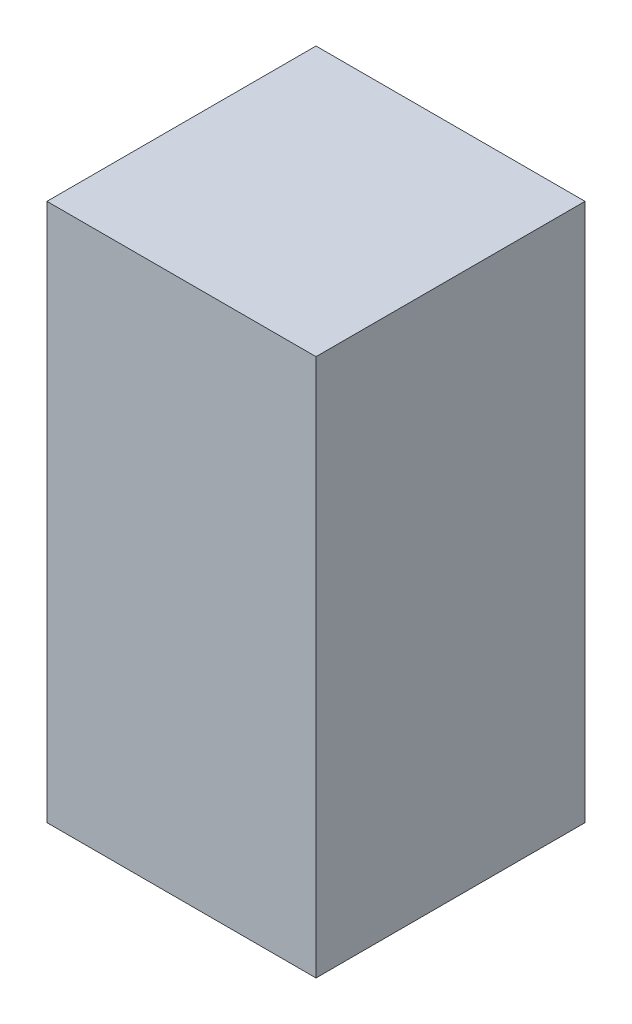
ISO-10303-21;
HEADER;
FILE_DESCRIPTION(('STEP AP214'),'2;1');
FILE_NAME('part.step','',(''),(''),'','','');
FILE_SCHEMA(('AUTOMOTIVE_DESIGN { 1 0 10303 214 1 1 1 1 }'));
ENDSEC;
DATA;
#1=APPLICATION_CONTEXT('core data for automotive mechanical design processes');
#2=APPLICATION_PROTOCOL_DEFINITION('international standard','automotive_design',2000,#1);
#3=PRODUCT_CONTEXT('',#1,'mechanical');
#4=PRODUCT('Part','Part','',(#3));
#5=PRODUCT_RELATED_PRODUCT_CATEGORY('part','',(#4));
#6=PRODUCT_DEFINITION_FORMATION('','',#4);
#7=PRODUCT_DEFINITION_CONTEXT('part definition',#1,'design');
#8=PRODUCT_DEFINITION('design','',#6,#7);
#9=PRODUCT_DEFINITION_SHAPE('','',#8);
#10=(LENGTH_UNIT() NAMED_UNIT(*) SI_UNIT(.MILLI.,.METRE.));
#11=(NAMED_UNIT(*) PLANE_ANGLE_UNIT() SI_UNIT($,.RADIAN.));
#12=(NAMED_UNIT(*) SI_UNIT($,.STERADIAN.) SOLID_ANGLE_UNIT());
#13=UNCERTAINTY_MEASURE_WITH_UNIT(LENGTH_MEASURE(1.E-05),#10,'distance_accuracy_value','');
#14=(GEOMETRIC_REPRESENTATION_CONTEXT(3) GLOBAL_UNCERTAINTY_ASSIGNED_CONTEXT((#13)) GLOBAL_UNIT_ASSIGNED_CONTEXT((#10,
#11,#12)) REPRESENTATION_CONTEXT('',''));
#15=CARTESIAN_POINT('',(0.,0.,0.));
#16=DIRECTION('',(0.,0.,1.));
#17=DIRECTION('',(1.,0.,0.));
#18=AXIS2_PLACEMENT_3D('',#15,#16,#17);
#19=CARTESIAN_POINT('',(-63.5,254.,-63.5));
#20=DIRECTION('',(1.,0.,0.));
#21=DIRECTION('',(0.,0.,-1.));
#22=AXIS2_PLACEMENT_3D('',#19,#20,#21);
#23=PLANE('',#22);
#24=DIRECTION('',(0.,0.,1.));
#25=VECTOR('',#24,1.);
#26=CARTESIAN_POINT('',(-63.5,0.,-63.5));
#27=LINE('',#26,#25);
#28=CARTESIAN_POINT('',(-63.5,0.,-63.5));
#29=VERTEX_POINT('',#28);
#30=CARTESIAN_POINT('',(-63.5,0.,63.5));
#31=VERTEX_POINT('',#30);
#32=EDGE_CURVE('E117',#29,#31,#27,.T.);
#33=ORIENTED_EDGE('',*,*,#32,.T.);
#34=DIRECTION('',(0.,-1.,0.));
#35=VECTOR('',#34,1.);
#36=CARTESIAN_POINT('',(-63.5,254.,63.5));
#37=LINE('',#36,#35);
#38=CARTESIAN_POINT('',(-63.5,254.,63.5));
#39=VERTEX_POINT('',#38);
#40=EDGE_CURVE('E11',#39,#31,#37,.T.);
#41=ORIENTED_EDGE('',*,*,#40,.F.);
#42=DIRECTION('',(0.,0.,1.));
#43=VECTOR('',#42,1.);
#44=CARTESIAN_POINT('',(-63.5,254.,-63.5));
#45=LINE('',#44,#43);
#46=CARTESIAN_POINT('',(-63.5,254.,-63.5));
#47=VERTEX_POINT('',#46);
#48=EDGE_CURVE('E101',#47,#39,#45,.T.);
#49=ORIENTED_EDGE('',*,*,#48,.F.);
#50=DIRECTION('',(0.,-1.,0.));
#51=VECTOR('',#50,1.);
#52=CARTESIAN_POINT('',(-63.5,254.,-63.5));
#53=LINE('',#52,#51);
#54=EDGE_CURVE('E113',#47,#29,#53,.T.);
#55=ORIENTED_EDGE('',*,*,#54,.T.);
#56=EDGE_LOOP('',(#33,#41,#49,#55));
#57=FACE_BOUND('',#56,.T.);
#58=ADVANCED_FACE('F49',(#57),#23,.F.);
#59=CARTESIAN_POINT('',(63.5,254.,63.5));
#60=DIRECTION('',(0.,0.,-1.));
#61=DIRECTION('',(-1.,0.,0.));
#62=AXIS2_PLACEMENT_3D('',#59,#60,#61);
#63=PLANE('',#62);
#64=DIRECTION('',(1.,0.,0.));
#65=VECTOR('',#64,1.);
#66=CARTESIAN_POINT('',(63.5,0.,63.5));
#67=LINE('',#66,#65);
#68=CARTESIAN_POINT('',(63.5,0.,63.5));
#69=VERTEX_POINT('',#68);
#70=EDGE_CURVE('E106',#31,#69,#67,.T.);
#71=ORIENTED_EDGE('',*,*,#70,.T.);
#72=DIRECTION('',(0.,-1.,0.));
#73=VECTOR('',#72,1.);
#74=CARTESIAN_POINT('',(63.5,254.,63.5));
#75=LINE('',#74,#73);
#76=CARTESIAN_POINT('',(63.5,254.,63.5));
#77=VERTEX_POINT('',#76);
#78=EDGE_CURVE('E58',#77,#69,#75,.T.);
#79=ORIENTED_EDGE('',*,*,#78,.F.);
#80=DIRECTION('',(1.,0.,0.));
#81=VECTOR('',#80,1.);
#82=CARTESIAN_POINT('',(63.5,254.,63.5));
#83=LINE('',#82,#81);
#84=EDGE_CURVE('E96',#39,#77,#83,.T.);
#85=ORIENTED_EDGE('',*,*,#84,.F.);
#86=ORIENTED_EDGE('',*,*,#40,.T.);
#87=EDGE_LOOP('',(#71,#79,#85,#86));
#88=FACE_BOUND('',#87,.T.);
#89=ADVANCED_FACE('F105',(#88),#63,.F.);
#90=CARTESIAN_POINT('',(63.5,254.,-63.5));
#91=DIRECTION('',(-1.,0.,0.));
#92=DIRECTION('',(0.,0.,1.));
#93=AXIS2_PLACEMENT_3D('',#90,#91,#92);
#94=PLANE('',#93);
#95=DIRECTION('',(0.,0.,-1.));
#96=VECTOR('',#95,1.);
#97=CARTESIAN_POINT('',(63.5,0.,-63.5));
#98=LINE('',#97,#96);
#99=CARTESIAN_POINT('',(63.5,0.,-63.5));
#100=VERTEX_POINT('',#99);
#101=EDGE_CURVE('E83',#69,#100,#98,.T.);
#102=ORIENTED_EDGE('',*,*,#101,.T.);
#103=DIRECTION('',(0.,-1.,0.));
#104=VECTOR('',#103,1.);
#105=CARTESIAN_POINT('',(63.5,254.,-63.5));
#106=LINE('',#105,#104);
#107=CARTESIAN_POINT('',(63.5,254.,-63.5));
#108=VERTEX_POINT('',#107);
#109=EDGE_CURVE('E108',#108,#100,#106,.T.);
#110=ORIENTED_EDGE('',*,*,#109,.F.);
#111=DIRECTION('',(0.,0.,-1.));
#112=VECTOR('',#111,1.);
#113=CARTESIAN_POINT('',(63.5,254.,-63.5));
#114=LINE('',#113,#112);
#115=EDGE_CURVE('E99',#77,#108,#114,.T.);
#116=ORIENTED_EDGE('',*,*,#115,.F.);
#117=ORIENTED_EDGE('',*,*,#78,.T.);
#118=EDGE_LOOP('',(#102,#110,#116,#117));
#119=FACE_BOUND('',#118,.T.);
#120=ADVANCED_FACE('F109',(#119),#94,.F.);
#121=CARTESIAN_POINT('',(63.5,254.,-63.5));
#122=DIRECTION('',(0.,0.,1.));
#123=DIRECTION('',(1.,0.,0.));
#124=AXIS2_PLACEMENT_3D('',#121,#122,#123);
#125=PLANE('',#124);
#126=DIRECTION('',(-1.,0.,0.));
#127=VECTOR('',#126,1.);
#128=CARTESIAN_POINT('',(63.5,0.,-63.5));
#129=LINE('',#128,#127);
#130=EDGE_CURVE('E89',#100,#29,#129,.T.);
#131=ORIENTED_EDGE('',*,*,#130,.T.);
#132=ORIENTED_EDGE('',*,*,#54,.F.);
#133=DIRECTION('',(-1.,0.,0.));
#134=VECTOR('',#133,1.);
#135=CARTESIAN_POINT('',(63.5,254.,-63.5));
#136=LINE('',#135,#134);
#137=EDGE_CURVE('E66',#108,#47,#136,.T.);
#138=ORIENTED_EDGE('',*,*,#137,.F.);
#139=ORIENTED_EDGE('',*,*,#109,.T.);
#140=EDGE_LOOP('',(#131,#132,#138,#139));
#141=FACE_BOUND('',#140,.T.);
#142=ADVANCED_FACE('F130',(#141),#125,.F.);
#143=CARTESIAN_POINT('',(0.,254.,0.));
#144=DIRECTION('',(0.,-1.,0.));
#145=DIRECTION('',(0.,0.,-1.));
#146=AXIS2_PLACEMENT_3D('',#143,#144,#145);
#147=PLANE('',#146);
#148=ORIENTED_EDGE('',*,*,#48,.T.);
#149=ORIENTED_EDGE('',*,*,#84,.T.);
#150=ORIENTED_EDGE('',*,*,#115,.T.);
#151=ORIENTED_EDGE('',*,*,#137,.T.);
#152=EDGE_LOOP('',(#148,#149,#150,#151));
#153=FACE_BOUND('',#152,.T.);
#154=ADVANCED_FACE('F97',(#153),#147,.F.);
#155=CARTESIAN_POINT('',(0.,0.,0.));
#156=DIRECTION('',(0.,-1.,0.));
#157=DIRECTION('',(0.,0.,-1.));
#158=AXIS2_PLACEMENT_3D('',#155,#156,#157);
#159=PLANE('',#158);
#160=ORIENTED_EDGE('',*,*,#32,.F.);
#161=ORIENTED_EDGE('',*,*,#130,.F.);
#162=ORIENTED_EDGE('',*,*,#101,.F.);
#163=ORIENTED_EDGE('',*,*,#70,.F.);
#164=EDGE_LOOP('',(#160,#161,#162,#163));
#165=FACE_BOUND('',#164,.T.);
#166=ADVANCED_FACE('F133',(#165),#159,.T.);
#167=CLOSED_SHELL('',(#58,#89,#120,#142,#154,#166));
#168=MANIFOLD_SOLID_BREP('B2',#167);
#169=ADVANCED_BREP_SHAPE_REPRESENTATION('',(#18,#168),#14);
#170=SHAPE_DEFINITION_REPRESENTATION(#9,#169);
ENDSEC;
END-ISO-10303-21;
